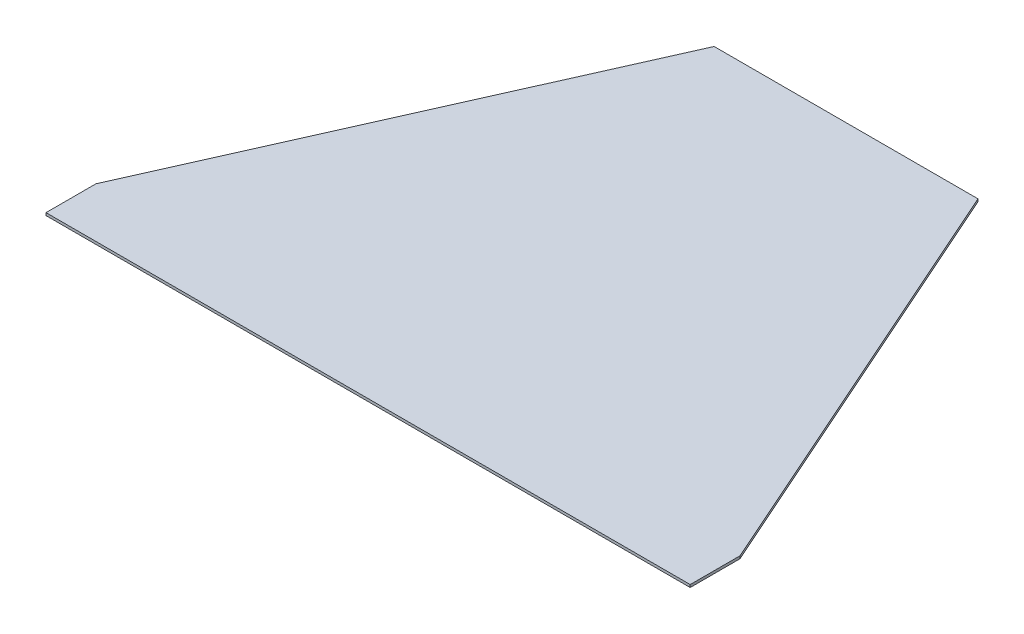
ISO-10303-21;
HEADER;
FILE_DESCRIPTION(('STEP AP214'),'2;1');
FILE_NAME('part.step','',(''),(''),'','','');
FILE_SCHEMA(('AUTOMOTIVE_DESIGN { 1 0 10303 214 1 1 1 1 }'));
ENDSEC;
DATA;
#1=APPLICATION_CONTEXT('core data for automotive mechanical design processes');
#2=APPLICATION_PROTOCOL_DEFINITION('international standard','automotive_design',2000,#1);
#3=PRODUCT_CONTEXT('',#1,'mechanical');
#4=PRODUCT('Part','Part','',(#3));
#5=PRODUCT_RELATED_PRODUCT_CATEGORY('part','',(#4));
#6=PRODUCT_DEFINITION_FORMATION('','',#4);
#7=PRODUCT_DEFINITION_CONTEXT('part definition',#1,'design');
#8=PRODUCT_DEFINITION('design','',#6,#7);
#9=PRODUCT_DEFINITION_SHAPE('','',#8);
#10=(LENGTH_UNIT() NAMED_UNIT(*) SI_UNIT(.MILLI.,.METRE.));
#11=(NAMED_UNIT(*) PLANE_ANGLE_UNIT() SI_UNIT($,.RADIAN.));
#12=(NAMED_UNIT(*) SI_UNIT($,.STERADIAN.) SOLID_ANGLE_UNIT());
#13=UNCERTAINTY_MEASURE_WITH_UNIT(LENGTH_MEASURE(1.E-05),#10,'distance_accuracy_value','');
#14=(GEOMETRIC_REPRESENTATION_CONTEXT(3) GLOBAL_UNCERTAINTY_ASSIGNED_CONTEXT((#13)) GLOBAL_UNIT_ASSIGNED_CONTEXT((#10,
#11,#12)) REPRESENTATION_CONTEXT('',''));
#15=CARTESIAN_POINT('',(0.,0.,0.));
#16=DIRECTION('',(0.,0.,1.));
#17=DIRECTION('',(1.,0.,0.));
#18=AXIS2_PLACEMENT_3D('',#15,#16,#17);
#19=CARTESIAN_POINT('',(-620.,5.,0.));
#20=DIRECTION('',(1.,0.,0.));
#21=DIRECTION('',(0.,0.,-1.));
#22=AXIS2_PLACEMENT_3D('',#19,#20,#21);
#23=PLANE('',#22);
#24=DIRECTION('',(0.,0.,1.));
#25=VECTOR('',#24,1.);
#26=CARTESIAN_POINT('',(-620.,0.,0.));
#27=LINE('',#26,#25);
#28=CARTESIAN_POINT('',(-620.,0.,-96.));
#29=VERTEX_POINT('',#28);
#30=CARTESIAN_POINT('',(-620.,0.,0.));
#31=VERTEX_POINT('',#30);
#32=EDGE_CURVE('E116',#29,#31,#27,.T.);
#33=ORIENTED_EDGE('',*,*,#32,.T.);
#34=DIRECTION('',(0.,-1.,0.));
#35=VECTOR('',#34,1.);
#36=CARTESIAN_POINT('',(-620.,5.,0.));
#37=LINE('',#36,#35);
#38=CARTESIAN_POINT('',(-620.,5.,0.));
#39=VERTEX_POINT('',#38);
#40=EDGE_CURVE('E11',#39,#31,#37,.T.);
#41=ORIENTED_EDGE('',*,*,#40,.F.);
#42=DIRECTION('',(0.,0.,1.));
#43=VECTOR('',#42,1.);
#44=CARTESIAN_POINT('',(-620.,5.,0.));
#45=LINE('',#44,#43);
#46=CARTESIAN_POINT('',(-620.,5.,-96.));
#47=VERTEX_POINT('',#46);
#48=EDGE_CURVE('E126',#47,#39,#45,.T.);
#49=ORIENTED_EDGE('',*,*,#48,.F.);
#50=DIRECTION('',(0.,-1.,0.));
#51=VECTOR('',#50,1.);
#52=CARTESIAN_POINT('',(-620.,5.,-96.));
#53=LINE('',#52,#51);
#54=EDGE_CURVE('E112',#47,#29,#53,.T.);
#55=ORIENTED_EDGE('',*,*,#54,.T.);
#56=EDGE_LOOP('',(#33,#41,#49,#55));
#57=FACE_BOUND('',#56,.T.);
#58=ADVANCED_FACE('F32',(#57),#23,.F.);
#59=CARTESIAN_POINT('',(-620.,5.,0.));
#60=DIRECTION('',(0.,0.,-1.));
#61=DIRECTION('',(-1.,0.,0.));
#62=AXIS2_PLACEMENT_3D('',#59,#60,#61);
#63=PLANE('',#62);
#64=DIRECTION('',(1.,0.,0.));
#65=VECTOR('',#64,1.);
#66=CARTESIAN_POINT('',(-620.,0.,0.));
#67=LINE('',#66,#65);
#68=CARTESIAN_POINT('',(620.,0.,0.));
#69=VERTEX_POINT('',#68);
#70=EDGE_CURVE('E119',#31,#69,#67,.T.);
#71=ORIENTED_EDGE('',*,*,#70,.T.);
#72=DIRECTION('',(0.,-1.,0.));
#73=VECTOR('',#72,1.);
#74=CARTESIAN_POINT('',(620.,5.,0.));
#75=LINE('',#74,#73);
#76=CARTESIAN_POINT('',(620.,5.,0.));
#77=VERTEX_POINT('',#76);
#78=EDGE_CURVE('E40',#77,#69,#75,.T.);
#79=ORIENTED_EDGE('',*,*,#78,.F.);
#80=DIRECTION('',(1.,0.,0.));
#81=VECTOR('',#80,1.);
#82=CARTESIAN_POINT('',(-620.,5.,0.));
#83=LINE('',#82,#81);
#84=EDGE_CURVE('E85',#39,#77,#83,.T.);
#85=ORIENTED_EDGE('',*,*,#84,.F.);
#86=ORIENTED_EDGE('',*,*,#40,.T.);
#87=EDGE_LOOP('',(#71,#79,#85,#86));
#88=FACE_BOUND('',#87,.T.);
#89=ADVANCED_FACE('F150',(#88),#63,.F.);
#90=CARTESIAN_POINT('',(620.,5.,0.));
#91=DIRECTION('',(-1.,0.,0.));
#92=DIRECTION('',(0.,0.,1.));
#93=AXIS2_PLACEMENT_3D('',#90,#91,#92);
#94=PLANE('',#93);
#95=DIRECTION('',(0.,0.,-1.));
#96=VECTOR('',#95,1.);
#97=CARTESIAN_POINT('',(620.,0.,0.));
#98=LINE('',#97,#96);
#99=CARTESIAN_POINT('',(620.,0.,-96.));
#100=VERTEX_POINT('',#99);
#101=EDGE_CURVE('E121',#69,#100,#98,.T.);
#102=ORIENTED_EDGE('',*,*,#101,.T.);
#103=DIRECTION('',(0.,-1.,0.));
#104=VECTOR('',#103,1.);
#105=CARTESIAN_POINT('',(620.,5.,-96.));
#106=LINE('',#105,#104);
#107=CARTESIAN_POINT('',(620.,5.,-96.));
#108=VERTEX_POINT('',#107);
#109=EDGE_CURVE('E107',#108,#100,#106,.T.);
#110=ORIENTED_EDGE('',*,*,#109,.F.);
#111=DIRECTION('',(0.,0.,-1.));
#112=VECTOR('',#111,1.);
#113=CARTESIAN_POINT('',(620.,5.,0.));
#114=LINE('',#113,#112);
#115=EDGE_CURVE('E98',#77,#108,#114,.T.);
#116=ORIENTED_EDGE('',*,*,#115,.F.);
#117=ORIENTED_EDGE('',*,*,#78,.T.);
#118=EDGE_LOOP('',(#102,#110,#116,#117));
#119=FACE_BOUND('',#118,.T.);
#120=ADVANCED_FACE('F132',(#119),#94,.F.);
#121=CARTESIAN_POINT('',(620.,5.,-96.));
#122=DIRECTION('',(-0.913902998068241,0.,0.405932642345845));
#123=DIRECTION('',(0.405932642345845,0.,0.913902998068241));
#124=AXIS2_PLACEMENT_3D('',#121,#122,#123);
#125=PLANE('',#124);
#126=DIRECTION('',(-0.405932642345845,0.,-0.913902998068242));
#127=VECTOR('',#126,1.);
#128=CARTESIAN_POINT('',(620.,0.,-96.));
#129=LINE('',#128,#127);
#130=CARTESIAN_POINT('',(254.,0.,-920.));
#131=VERTEX_POINT('',#130);
#132=EDGE_CURVE('E106',#100,#131,#129,.T.);
#133=ORIENTED_EDGE('',*,*,#132,.T.);
#134=DIRECTION('',(0.,-1.,0.));
#135=VECTOR('',#134,1.);
#136=CARTESIAN_POINT('',(254.,5.,-920.));
#137=LINE('',#136,#135);
#138=CARTESIAN_POINT('',(254.,5.,-920.));
#139=VERTEX_POINT('',#138);
#140=EDGE_CURVE('E103',#139,#131,#137,.T.);
#141=ORIENTED_EDGE('',*,*,#140,.F.);
#142=DIRECTION('',(-0.405932642345845,0.,-0.913902998068242));
#143=VECTOR('',#142,1.);
#144=CARTESIAN_POINT('',(620.,5.,-96.));
#145=LINE('',#144,#143);
#146=EDGE_CURVE('E92',#108,#139,#145,.T.);
#147=ORIENTED_EDGE('',*,*,#146,.F.);
#148=ORIENTED_EDGE('',*,*,#109,.T.);
#149=EDGE_LOOP('',(#133,#141,#147,#148));
#150=FACE_BOUND('',#149,.T.);
#151=ADVANCED_FACE('F104',(#150),#125,.F.);
#152=CARTESIAN_POINT('',(-254.,5.,-920.));
#153=DIRECTION('',(0.,0.,1.));
#154=DIRECTION('',(1.,0.,0.));
#155=AXIS2_PLACEMENT_3D('',#152,#153,#154);
#156=PLANE('',#155);
#157=DIRECTION('',(-1.,0.,0.));
#158=VECTOR('',#157,1.);
#159=CARTESIAN_POINT('',(-254.,0.,-920.));
#160=LINE('',#159,#158);
#161=CARTESIAN_POINT('',(-254.,0.,-920.));
#162=VERTEX_POINT('',#161);
#163=EDGE_CURVE('E71',#131,#162,#160,.T.);
#164=ORIENTED_EDGE('',*,*,#163,.T.);
#165=DIRECTION('',(0.,-1.,0.));
#166=VECTOR('',#165,1.);
#167=CARTESIAN_POINT('',(-254.,5.,-920.));
#168=LINE('',#167,#166);
#169=CARTESIAN_POINT('',(-254.,5.,-920.));
#170=VERTEX_POINT('',#169);
#171=EDGE_CURVE('E108',#170,#162,#168,.T.);
#172=ORIENTED_EDGE('',*,*,#171,.F.);
#173=DIRECTION('',(-1.,0.,0.));
#174=VECTOR('',#173,1.);
#175=CARTESIAN_POINT('',(-254.,5.,-920.));
#176=LINE('',#175,#174);
#177=EDGE_CURVE('E96',#139,#170,#176,.T.);
#178=ORIENTED_EDGE('',*,*,#177,.F.);
#179=ORIENTED_EDGE('',*,*,#140,.T.);
#180=EDGE_LOOP('',(#164,#172,#178,#179));
#181=FACE_BOUND('',#180,.T.);
#182=ADVANCED_FACE('F110',(#181),#156,.F.);
#183=CARTESIAN_POINT('',(-620.,5.,-96.));
#184=DIRECTION('',(0.913902998068241,0.,0.405932642345845));
#185=DIRECTION('',(0.405932642345845,0.,-0.913902998068241));
#186=AXIS2_PLACEMENT_3D('',#183,#184,#185);
#187=PLANE('',#186);
#188=DIRECTION('',(-0.405932642345845,0.,0.913902998068242));
#189=VECTOR('',#188,1.);
#190=CARTESIAN_POINT('',(-620.,0.,-96.));
#191=LINE('',#190,#189);
#192=EDGE_CURVE('E77',#162,#29,#191,.T.);
#193=ORIENTED_EDGE('',*,*,#192,.T.);
#194=ORIENTED_EDGE('',*,*,#54,.F.);
#195=DIRECTION('',(-0.405932642345845,0.,0.913902998068242));
#196=VECTOR('',#195,1.);
#197=CARTESIAN_POINT('',(-620.,5.,-96.));
#198=LINE('',#197,#196);
#199=EDGE_CURVE('E48',#170,#47,#198,.T.);
#200=ORIENTED_EDGE('',*,*,#199,.F.);
#201=ORIENTED_EDGE('',*,*,#171,.T.);
#202=EDGE_LOOP('',(#193,#194,#200,#201));
#203=FACE_BOUND('',#202,.T.);
#204=ADVANCED_FACE('F139',(#203),#187,.F.);
#205=CARTESIAN_POINT('',(0.,5.,0.));
#206=DIRECTION('',(0.,-1.,0.));
#207=DIRECTION('',(0.,0.,-1.));
#208=AXIS2_PLACEMENT_3D('',#205,#206,#207);
#209=PLANE('',#208);
#210=ORIENTED_EDGE('',*,*,#48,.T.);
#211=ORIENTED_EDGE('',*,*,#84,.T.);
#212=ORIENTED_EDGE('',*,*,#115,.T.);
#213=ORIENTED_EDGE('',*,*,#146,.T.);
#214=ORIENTED_EDGE('',*,*,#177,.T.);
#215=ORIENTED_EDGE('',*,*,#199,.T.);
#216=EDGE_LOOP('',(#210,#211,#212,#213,#214,#215));
#217=FACE_BOUND('',#216,.T.);
#218=ADVANCED_FACE('F94',(#217),#209,.F.);
#219=CARTESIAN_POINT('',(0.,0.,0.));
#220=DIRECTION('',(0.,-1.,0.));
#221=DIRECTION('',(0.,0.,-1.));
#222=AXIS2_PLACEMENT_3D('',#219,#220,#221);
#223=PLANE('',#222);
#224=ORIENTED_EDGE('',*,*,#32,.F.);
#225=ORIENTED_EDGE('',*,*,#192,.F.);
#226=ORIENTED_EDGE('',*,*,#163,.F.);
#227=ORIENTED_EDGE('',*,*,#132,.F.);
#228=ORIENTED_EDGE('',*,*,#101,.F.);
#229=ORIENTED_EDGE('',*,*,#70,.F.);
#230=EDGE_LOOP('',(#224,#225,#226,#227,#228,#229));
#231=FACE_BOUND('',#230,.T.);
#232=ADVANCED_FACE('F135',(#231),#223,.T.);
#233=CLOSED_SHELL('',(#58,#89,#120,#151,#182,#204,#218,#232));
#234=MANIFOLD_SOLID_BREP('B2',#233);
#235=ADVANCED_BREP_SHAPE_REPRESENTATION('',(#18,#234),#14);
#236=SHAPE_DEFINITION_REPRESENTATION(#9,#235);
ENDSEC;
END-ISO-10303-21;
